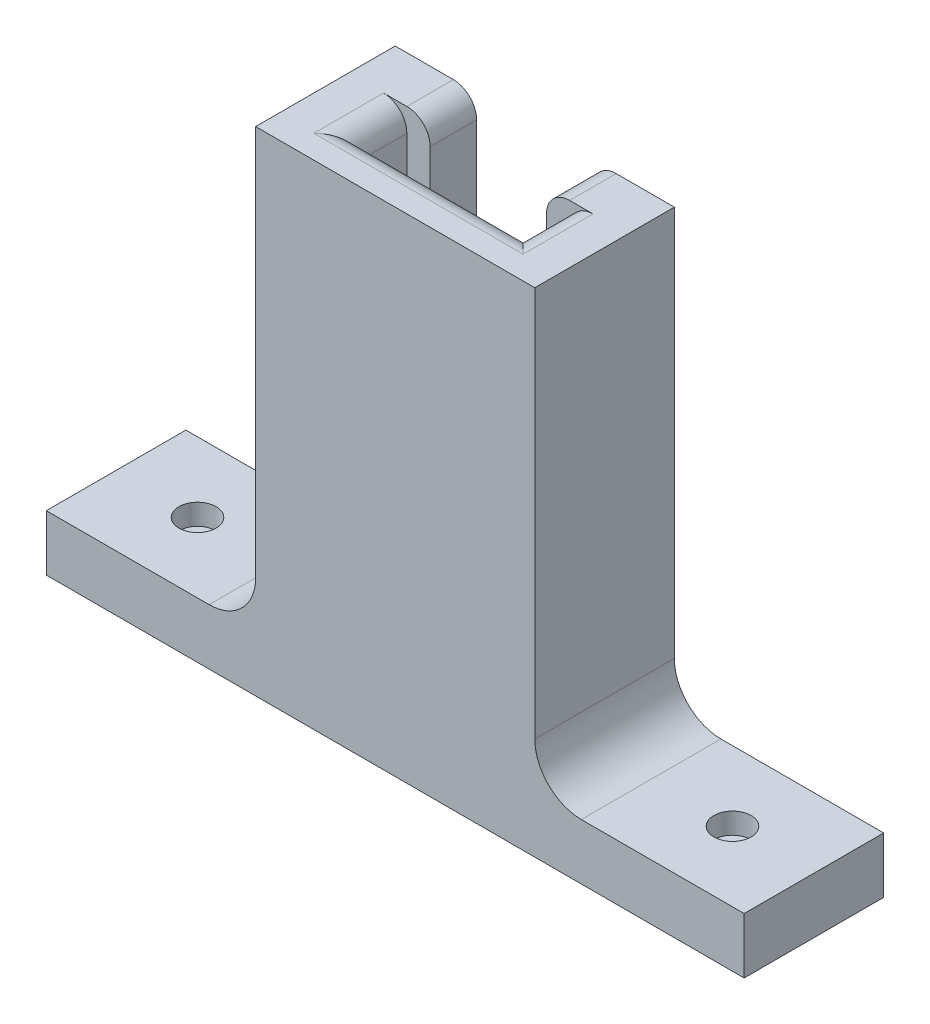
ISO-10303-21;
HEADER;
FILE_DESCRIPTION(('STEP AP214'),'2;1');
FILE_NAME('part.step','',(''),(''),'','','');
FILE_SCHEMA(('AUTOMOTIVE_DESIGN { 1 0 10303 214 1 1 1 1 }'));
ENDSEC;
DATA;
#1=APPLICATION_CONTEXT('core data for automotive mechanical design processes');
#2=APPLICATION_PROTOCOL_DEFINITION('international standard','automotive_design',2000,#1);
#3=PRODUCT_CONTEXT('',#1,'mechanical');
#4=PRODUCT('Part','Part','',(#3));
#5=PRODUCT_RELATED_PRODUCT_CATEGORY('part','',(#4));
#6=PRODUCT_DEFINITION_FORMATION('','',#4);
#7=PRODUCT_DEFINITION_CONTEXT('part definition',#1,'design');
#8=PRODUCT_DEFINITION('design','',#6,#7);
#9=PRODUCT_DEFINITION_SHAPE('','',#8);
#10=(LENGTH_UNIT() NAMED_UNIT(*) SI_UNIT(.MILLI.,.METRE.));
#11=(NAMED_UNIT(*) PLANE_ANGLE_UNIT() SI_UNIT($,.RADIAN.));
#12=(NAMED_UNIT(*) SI_UNIT($,.STERADIAN.) SOLID_ANGLE_UNIT());
#13=UNCERTAINTY_MEASURE_WITH_UNIT(LENGTH_MEASURE(1.E-05),#10,'distance_accuracy_value','');
#14=(GEOMETRIC_REPRESENTATION_CONTEXT(3) GLOBAL_UNCERTAINTY_ASSIGNED_CONTEXT((#13)) GLOBAL_UNIT_ASSIGNED_CONTEXT((#10,
#11,#12)) REPRESENTATION_CONTEXT('',''));
#15=CARTESIAN_POINT('',(0.,0.,0.));
#16=DIRECTION('',(0.,0.,1.));
#17=DIRECTION('',(1.,0.,0.));
#18=AXIS2_PLACEMENT_3D('',#15,#16,#17);
#19=CARTESIAN_POINT('',(57.5,-95.,15.));
#20=DIRECTION('',(0.,1.,0.));
#21=DIRECTION('',(0.,0.,1.));
#22=AXIS2_PLACEMENT_3D('',#19,#20,#21);
#23=CYLINDRICAL_SURFACE('',#22,2.);
#24=CARTESIAN_POINT('',(57.5,-56.,15.));
#25=DIRECTION('',(0.,-1.,0.));
#26=DIRECTION('',(0.,0.,-1.));
#27=AXIS2_PLACEMENT_3D('',#24,#25,#26);
#28=CIRCLE('',#27,2.);
#29=CARTESIAN_POINT('',(57.5,-56.,13.));
#30=VERTEX_POINT('',#29);
#31=EDGE_CURVE('E286',#30,#30,#28,.F.);
#32=ORIENTED_EDGE('',*,*,#31,.F.);
#33=EDGE_LOOP('',(#32));
#34=FACE_BOUND('',#33,.T.);
#35=CARTESIAN_POINT('',(57.5,-48.5,15.));
#36=DIRECTION('',(0.,1.,0.));
#37=DIRECTION('',(0.,0.,1.));
#38=AXIS2_PLACEMENT_3D('',#35,#36,#37);
#39=CIRCLE('',#38,2.);
#40=CARTESIAN_POINT('',(57.5,-48.5,17.));
#41=VERTEX_POINT('',#40);
#42=EDGE_CURVE('E79',#41,#41,#39,.T.);
#43=ORIENTED_EDGE('',*,*,#42,.T.);
#44=EDGE_LOOP('',(#43));
#45=FACE_BOUND('',#44,.T.);
#46=ADVANCED_FACE('F75',(#34,#45),#23,.F.);
#47=CARTESIAN_POINT('',(-57.5,-95.,15.));
#48=DIRECTION('',(0.,1.,0.));
#49=DIRECTION('',(0.,0.,1.));
#50=AXIS2_PLACEMENT_3D('',#47,#48,#49);
#51=CYLINDRICAL_SURFACE('',#50,2.);
#52=CARTESIAN_POINT('',(-57.5,-56.,15.));
#53=DIRECTION('',(0.,-1.,0.));
#54=DIRECTION('',(0.,0.,-1.));
#55=AXIS2_PLACEMENT_3D('',#52,#53,#54);
#56=CIRCLE('',#55,2.);
#57=CARTESIAN_POINT('',(-57.5,-56.,13.));
#58=VERTEX_POINT('',#57);
#59=EDGE_CURVE('E271',#58,#58,#56,.T.);
#60=ORIENTED_EDGE('',*,*,#59,.T.);
#61=EDGE_LOOP('',(#60));
#62=FACE_BOUND('',#61,.T.);
#63=CARTESIAN_POINT('',(-57.5,-48.5,15.));
#64=DIRECTION('',(0.,1.,0.));
#65=DIRECTION('',(0.,0.,1.));
#66=AXIS2_PLACEMENT_3D('',#63,#64,#65);
#67=CIRCLE('',#66,2.);
#68=CARTESIAN_POINT('',(-57.5,-48.5,17.));
#69=VERTEX_POINT('',#68);
#70=EDGE_CURVE('E273',#69,#69,#67,.F.);
#71=ORIENTED_EDGE('',*,*,#70,.F.);
#72=EDGE_LOOP('',(#71));
#73=FACE_BOUND('',#72,.T.);
#74=ADVANCED_FACE('F508',(#62,#73),#51,.F.);
#75=CARTESIAN_POINT('',(0.,0.,0.));
#76=DIRECTION('',(0.,0.,1.));
#77=DIRECTION('',(1.,0.,0.));
#78=AXIS2_PLACEMENT_3D('',#75,#76,#77);
#79=PLANE('',#78);
#80=DIRECTION('',(0.,1.,0.));
#81=VECTOR('',#80,1.);
#82=CARTESIAN_POINT('',(12.5,-172.,0.));
#83=LINE('',#82,#81);
#84=CARTESIAN_POINT('',(12.5,-56.,0.));
#85=VERTEX_POINT('',#84);
#86=CARTESIAN_POINT('',(12.5,45.,0.));
#87=VERTEX_POINT('',#86);
#88=EDGE_CURVE('E295',#85,#87,#83,.T.);
#89=ORIENTED_EDGE('',*,*,#88,.T.);
#90=CARTESIAN_POINT('',(17.5,45.,0.));
#91=DIRECTION('',(0.,0.,1.));
#92=DIRECTION('',(1.,0.,0.));
#93=AXIS2_PLACEMENT_3D('',#90,#91,#92);
#94=CIRCLE('',#93,5.);
#95=CARTESIAN_POINT('',(17.5,50.,0.));
#96=VERTEX_POINT('',#95);
#97=EDGE_CURVE('E258',#87,#96,#94,.F.);
#98=ORIENTED_EDGE('',*,*,#97,.T.);
#99=DIRECTION('',(-1.,0.,0.));
#100=VECTOR('',#99,1.);
#101=CARTESIAN_POINT('',(30.,50.,0.));
#102=LINE('',#101,#100);
#103=CARTESIAN_POINT('',(30.,50.,0.));
#104=VERTEX_POINT('',#103);
#105=EDGE_CURVE('E378',#104,#96,#102,.T.);
#106=ORIENTED_EDGE('',*,*,#105,.F.);
#107=DIRECTION('',(0.,-1.,0.));
#108=VECTOR('',#107,1.);
#109=CARTESIAN_POINT('',(30.,50.,0.));
#110=LINE('',#109,#108);
#111=CARTESIAN_POINT('',(30.,-34.,0.));
#112=VERTEX_POINT('',#111);
#113=EDGE_CURVE('E369',#104,#112,#110,.T.);
#114=ORIENTED_EDGE('',*,*,#113,.T.);
#115=CARTESIAN_POINT('',(40.,-34.,0.));
#116=DIRECTION('',(0.,0.,1.));
#117=DIRECTION('',(1.,0.,0.));
#118=AXIS2_PLACEMENT_3D('',#115,#116,#117);
#119=CIRCLE('',#118,10.);
#120=CARTESIAN_POINT('',(40.,-44.,0.));
#121=VERTEX_POINT('',#120);
#122=EDGE_CURVE('E395',#112,#121,#119,.T.);
#123=ORIENTED_EDGE('',*,*,#122,.T.);
#124=DIRECTION('',(-1.,0.,0.));
#125=VECTOR('',#124,1.);
#126=CARTESIAN_POINT('',(0.,-44.,0.));
#127=LINE('',#126,#125);
#128=CARTESIAN_POINT('',(75.,-44.,0.));
#129=VERTEX_POINT('',#128);
#130=EDGE_CURVE('E332',#129,#121,#127,.T.);
#131=ORIENTED_EDGE('',*,*,#130,.F.);
#132=DIRECTION('',(0.,-1.,0.));
#133=VECTOR('',#132,1.);
#134=CARTESIAN_POINT('',(75.,0.,0.));
#135=LINE('',#134,#133);
#136=CARTESIAN_POINT('',(75.,-56.,0.));
#137=VERTEX_POINT('',#136);
#138=EDGE_CURVE('E351',#129,#137,#135,.T.);
#139=ORIENTED_EDGE('',*,*,#138,.T.);
#140=DIRECTION('',(-1.,0.,0.));
#141=VECTOR('',#140,1.);
#142=CARTESIAN_POINT('',(0.,-56.,0.));
#143=LINE('',#142,#141);
#144=EDGE_CURVE('E348',#137,#85,#143,.T.);
#145=ORIENTED_EDGE('',*,*,#144,.T.);
#146=EDGE_LOOP('',(#89,#98,#106,#114,#123,#131,#139,#145));
#147=FACE_BOUND('',#146,.T.);
#148=ADVANCED_FACE('F417',(#147),#79,.F.);
#149=CARTESIAN_POINT('',(-75.,0.,30.));
#150=DIRECTION('',(1.,0.,0.));
#151=DIRECTION('',(0.,0.,-1.));
#152=AXIS2_PLACEMENT_3D('',#149,#150,#151);
#153=PLANE('',#152);
#154=DIRECTION('',(0.,-1.,0.));
#155=VECTOR('',#154,1.);
#156=CARTESIAN_POINT('',(-75.,0.,0.));
#157=LINE('',#156,#155);
#158=CARTESIAN_POINT('',(-75.,-44.,0.));
#159=VERTEX_POINT('',#158);
#160=CARTESIAN_POINT('',(-75.,-56.,0.));
#161=VERTEX_POINT('',#160);
#162=EDGE_CURVE('E343',#159,#161,#157,.T.);
#163=ORIENTED_EDGE('',*,*,#162,.T.);
#164=DIRECTION('',(0.,0.,-1.));
#165=VECTOR('',#164,1.);
#166=CARTESIAN_POINT('',(-75.,-56.,30.));
#167=LINE('',#166,#165);
#168=CARTESIAN_POINT('',(-75.,-56.,30.));
#169=VERTEX_POINT('',#168);
#170=EDGE_CURVE('E358',#169,#161,#167,.T.);
#171=ORIENTED_EDGE('',*,*,#170,.F.);
#172=DIRECTION('',(0.,-1.,0.));
#173=VECTOR('',#172,1.);
#174=CARTESIAN_POINT('',(-75.,0.,30.));
#175=LINE('',#174,#173);
#176=CARTESIAN_POINT('',(-75.,-44.,30.));
#177=VERTEX_POINT('',#176);
#178=EDGE_CURVE('E331',#177,#169,#175,.T.);
#179=ORIENTED_EDGE('',*,*,#178,.F.);
#180=DIRECTION('',(0.,0.,-1.));
#181=VECTOR('',#180,1.);
#182=CARTESIAN_POINT('',(-75.,-44.,30.));
#183=LINE('',#182,#181);
#184=EDGE_CURVE('E361',#177,#159,#183,.T.);
#185=ORIENTED_EDGE('',*,*,#184,.T.);
#186=EDGE_LOOP('',(#163,#171,#179,#185));
#187=FACE_BOUND('',#186,.T.);
#188=ADVANCED_FACE('F460',(#187),#153,.F.);
#189=CARTESIAN_POINT('',(0.,-56.,30.));
#190=DIRECTION('',(0.,-1.,0.));
#191=DIRECTION('',(0.,0.,-1.));
#192=AXIS2_PLACEMENT_3D('',#189,#190,#191);
#193=PLANE('',#192);
#194=ORIENTED_EDGE('',*,*,#31,.T.);
#195=EDGE_LOOP('',(#194));
#196=FACE_BOUND('',#195,.T.);
#197=ORIENTED_EDGE('',*,*,#59,.F.);
#198=EDGE_LOOP('',(#197));
#199=FACE_BOUND('',#198,.T.);
#200=DIRECTION('',(0.,0.,-1.));
#201=VECTOR('',#200,1.);
#202=CARTESIAN_POINT('',(-12.5,-56.,30.));
#203=LINE('',#202,#201);
#204=CARTESIAN_POINT('',(-12.5,-56.,10.));
#205=VERTEX_POINT('',#204);
#206=CARTESIAN_POINT('',(-12.5,-56.,0.));
#207=VERTEX_POINT('',#206);
#208=EDGE_CURVE('E326',#205,#207,#203,.T.);
#209=ORIENTED_EDGE('',*,*,#208,.F.);
#210=DIRECTION('',(1.,0.,0.));
#211=VECTOR('',#210,1.);
#212=CARTESIAN_POINT('',(0.,-56.,10.));
#213=LINE('',#212,#211);
#214=CARTESIAN_POINT('',(-17.5,-56.,10.));
#215=VERTEX_POINT('',#214);
#216=EDGE_CURVE('E294',#215,#205,#213,.T.);
#217=ORIENTED_EDGE('',*,*,#216,.F.);
#218=DIRECTION('',(0.,0.,-1.));
#219=VECTOR('',#218,1.);
#220=CARTESIAN_POINT('',(-17.5,-56.,30.));
#221=LINE('',#220,#219);
#222=CARTESIAN_POINT('',(-17.5,-56.,20.));
#223=VERTEX_POINT('',#222);
#224=EDGE_CURVE('E313',#223,#215,#221,.T.);
#225=ORIENTED_EDGE('',*,*,#224,.F.);
#226=DIRECTION('',(1.,0.,0.));
#227=VECTOR('',#226,1.);
#228=CARTESIAN_POINT('',(0.,-56.,20.));
#229=LINE('',#228,#227);
#230=CARTESIAN_POINT('',(17.5,-56.,20.));
#231=VERTEX_POINT('',#230);
#232=EDGE_CURVE('E315',#223,#231,#229,.T.);
#233=ORIENTED_EDGE('',*,*,#232,.T.);
#234=DIRECTION('',(0.,0.,-1.));
#235=VECTOR('',#234,1.);
#236=CARTESIAN_POINT('',(17.5,-56.,30.));
#237=LINE('',#236,#235);
#238=CARTESIAN_POINT('',(17.5,-56.,10.));
#239=VERTEX_POINT('',#238);
#240=EDGE_CURVE('E318',#231,#239,#237,.T.);
#241=ORIENTED_EDGE('',*,*,#240,.T.);
#242=DIRECTION('',(1.,0.,0.));
#243=VECTOR('',#242,1.);
#244=CARTESIAN_POINT('',(0.,-56.,10.));
#245=LINE('',#244,#243);
#246=CARTESIAN_POINT('',(12.5,-56.,10.));
#247=VERTEX_POINT('',#246);
#248=EDGE_CURVE('E321',#247,#239,#245,.T.);
#249=ORIENTED_EDGE('',*,*,#248,.F.);
#250=DIRECTION('',(0.,0.,-1.));
#251=VECTOR('',#250,1.);
#252=CARTESIAN_POINT('',(12.5,-56.,30.));
#253=LINE('',#252,#251);
#254=EDGE_CURVE('E323',#247,#85,#253,.T.);
#255=ORIENTED_EDGE('',*,*,#254,.T.);
#256=ORIENTED_EDGE('',*,*,#144,.F.);
#257=DIRECTION('',(0.,0.,-1.));
#258=VECTOR('',#257,1.);
#259=CARTESIAN_POINT('',(75.,-56.,30.));
#260=LINE('',#259,#258);
#261=CARTESIAN_POINT('',(75.,-56.,30.));
#262=VERTEX_POINT('',#261);
#263=EDGE_CURVE('E356',#262,#137,#260,.T.);
#264=ORIENTED_EDGE('',*,*,#263,.F.);
#265=DIRECTION('',(-1.,0.,0.));
#266=VECTOR('',#265,1.);
#267=CARTESIAN_POINT('',(0.,-56.,30.));
#268=LINE('',#267,#266);
#269=EDGE_CURVE('E335',#262,#169,#268,.T.);
#270=ORIENTED_EDGE('',*,*,#269,.T.);
#271=ORIENTED_EDGE('',*,*,#170,.T.);
#272=EDGE_CURVE('E347',#207,#161,#143,.T.);
#273=ORIENTED_EDGE('',*,*,#272,.F.);
#274=EDGE_LOOP('',(#209,#217,#225,#233,#241,#249,#255,#256,#264,#270,#271,#273));
#275=FACE_BOUND('',#274,.T.);
#276=ADVANCED_FACE('F426',(#196,#199,#275),#193,.T.);
#277=CARTESIAN_POINT('',(75.,0.,30.));
#278=DIRECTION('',(1.,0.,0.));
#279=DIRECTION('',(0.,0.,-1.));
#280=AXIS2_PLACEMENT_3D('',#277,#278,#279);
#281=PLANE('',#280);
#282=ORIENTED_EDGE('',*,*,#138,.F.);
#283=DIRECTION('',(0.,0.,-1.));
#284=VECTOR('',#283,1.);
#285=CARTESIAN_POINT('',(75.,-44.,30.));
#286=LINE('',#285,#284);
#287=CARTESIAN_POINT('',(75.,-44.,30.));
#288=VERTEX_POINT('',#287);
#289=EDGE_CURVE('E354',#288,#129,#286,.T.);
#290=ORIENTED_EDGE('',*,*,#289,.F.);
#291=DIRECTION('',(0.,-1.,0.));
#292=VECTOR('',#291,1.);
#293=CARTESIAN_POINT('',(75.,0.,30.));
#294=LINE('',#293,#292);
#295=EDGE_CURVE('E338',#288,#262,#294,.T.);
#296=ORIENTED_EDGE('',*,*,#295,.T.);
#297=ORIENTED_EDGE('',*,*,#263,.T.);
#298=EDGE_LOOP('',(#282,#290,#296,#297));
#299=FACE_BOUND('',#298,.T.);
#300=ADVANCED_FACE('F496',(#299),#281,.T.);
#301=CARTESIAN_POINT('',(0.,-44.,30.));
#302=DIRECTION('',(0.,-1.,0.));
#303=DIRECTION('',(0.,0.,-1.));
#304=AXIS2_PLACEMENT_3D('',#301,#302,#303);
#305=PLANE('',#304);
#306=CARTESIAN_POINT('',(57.5,-44.,15.));
#307=DIRECTION('',(0.,-1.,0.));
#308=DIRECTION('',(0.,0.,1.));
#309=AXIS2_PLACEMENT_3D('',#306,#307,#308);
#310=CIRCLE('',#309,4.00000000000001);
#311=CARTESIAN_POINT('',(57.5,-44.,19.));
#312=VERTEX_POINT('',#311);
#313=EDGE_CURVE('E824',#312,#312,#310,.T.);
#314=ORIENTED_EDGE('',*,*,#313,.T.);
#315=EDGE_LOOP('',(#314));
#316=FACE_BOUND('',#315,.T.);
#317=ORIENTED_EDGE('',*,*,#130,.T.);
#318=DIRECTION('',(0.,0.,-1.));
#319=VECTOR('',#318,1.);
#320=CARTESIAN_POINT('',(40.,-44.,30.));
#321=LINE('',#320,#319);
#322=CARTESIAN_POINT('',(40.,-44.,30.));
#323=VERTEX_POINT('',#322);
#324=EDGE_CURVE('E388',#121,#323,#321,.F.);
#325=ORIENTED_EDGE('',*,*,#324,.T.);
#326=DIRECTION('',(-1.,0.,0.));
#327=VECTOR('',#326,1.);
#328=CARTESIAN_POINT('',(0.,-44.,30.));
#329=LINE('',#328,#327);
#330=EDGE_CURVE('E333',#288,#323,#329,.T.);
#331=ORIENTED_EDGE('',*,*,#330,.F.);
#332=ORIENTED_EDGE('',*,*,#289,.T.);
#333=EDGE_LOOP('',(#317,#325,#331,#332));
#334=FACE_BOUND('',#333,.T.);
#335=ADVANCED_FACE('F489',(#316,#334),#305,.F.);
#336=CARTESIAN_POINT('',(-57.5,-44.,15.));
#337=DIRECTION('',(0.,1.,0.));
#338=DIRECTION('',(0.,0.,1.));
#339=AXIS2_PLACEMENT_3D('',#336,#337,#338);
#340=CIRCLE('',#339,4.00000000000001);
#341=CARTESIAN_POINT('',(-57.5,-44.,19.));
#342=VERTEX_POINT('',#341);
#343=EDGE_CURVE('E281',#342,#342,#340,.T.);
#344=ORIENTED_EDGE('',*,*,#343,.F.);
#345=EDGE_LOOP('',(#344));
#346=FACE_BOUND('',#345,.T.);
#347=CARTESIAN_POINT('',(-40.,-44.,30.));
#348=VERTEX_POINT('',#347);
#349=EDGE_CURVE('E329',#348,#177,#329,.T.);
#350=ORIENTED_EDGE('',*,*,#349,.F.);
#351=DIRECTION('',(0.,0.,-1.));
#352=VECTOR('',#351,1.);
#353=CARTESIAN_POINT('',(-40.,-44.,0.));
#354=LINE('',#353,#352);
#355=CARTESIAN_POINT('',(-40.,-44.,0.));
#356=VERTEX_POINT('',#355);
#357=EDGE_CURVE('E390',#348,#356,#354,.T.);
#358=ORIENTED_EDGE('',*,*,#357,.T.);
#359=EDGE_CURVE('E341',#356,#159,#127,.T.);
#360=ORIENTED_EDGE('',*,*,#359,.T.);
#361=ORIENTED_EDGE('',*,*,#184,.F.);
#362=EDGE_LOOP('',(#350,#358,#360,#361));
#363=FACE_BOUND('',#362,.T.);
#364=ADVANCED_FACE('F466',(#346,#363),#305,.F.);
#365=CARTESIAN_POINT('',(-17.5,50.,0.));
#366=VERTEX_POINT('',#365);
#367=CARTESIAN_POINT('',(-30.,50.,0.));
#368=VERTEX_POINT('',#367);
#369=EDGE_CURVE('E377',#366,#368,#102,.T.);
#370=ORIENTED_EDGE('',*,*,#369,.F.);
#371=CARTESIAN_POINT('',(-17.5,45.,0.));
#372=DIRECTION('',(0.,0.,1.));
#373=DIRECTION('',(1.,0.,0.));
#374=AXIS2_PLACEMENT_3D('',#371,#372,#373);
#375=CIRCLE('',#374,5.);
#376=CARTESIAN_POINT('',(-12.5,45.,0.));
#377=VERTEX_POINT('',#376);
#378=EDGE_CURVE('E238',#366,#377,#375,.F.);
#379=ORIENTED_EDGE('',*,*,#378,.T.);
#380=DIRECTION('',(0.,1.,0.));
#381=VECTOR('',#380,1.);
#382=CARTESIAN_POINT('',(-12.5,-172.,0.));
#383=LINE('',#382,#381);
#384=EDGE_CURVE('E291',#207,#377,#383,.T.);
#385=ORIENTED_EDGE('',*,*,#384,.F.);
#386=ORIENTED_EDGE('',*,*,#272,.T.);
#387=ORIENTED_EDGE('',*,*,#162,.F.);
#388=ORIENTED_EDGE('',*,*,#359,.F.);
#389=CARTESIAN_POINT('',(-40.,-34.,0.));
#390=DIRECTION('',(0.,0.,1.));
#391=DIRECTION('',(1.,0.,0.));
#392=AXIS2_PLACEMENT_3D('',#389,#390,#391);
#393=CIRCLE('',#392,10.);
#394=CARTESIAN_POINT('',(-30.,-34.,0.));
#395=VERTEX_POINT('',#394);
#396=EDGE_CURVE('E399',#356,#395,#393,.T.);
#397=ORIENTED_EDGE('',*,*,#396,.T.);
#398=DIRECTION('',(0.,-1.,0.));
#399=VECTOR('',#398,1.);
#400=CARTESIAN_POINT('',(-30.,50.,0.));
#401=LINE('',#400,#399);
#402=EDGE_CURVE('E328',#368,#395,#401,.T.);
#403=ORIENTED_EDGE('',*,*,#402,.F.);
#404=EDGE_LOOP('',(#370,#379,#385,#386,#387,#388,#397,#403));
#405=FACE_BOUND('',#404,.T.);
#406=ADVANCED_FACE('F454',(#405),#79,.F.);
#407=CARTESIAN_POINT('',(0.,0.,30.));
#408=DIRECTION('',(0.,0.,1.));
#409=DIRECTION('',(1.,0.,0.));
#410=AXIS2_PLACEMENT_3D('',#407,#408,#409);
#411=PLANE('',#410);
#412=DIRECTION('',(0.,-1.,0.));
#413=VECTOR('',#412,1.);
#414=CARTESIAN_POINT('',(-30.,50.,30.));
#415=LINE('',#414,#413);
#416=CARTESIAN_POINT('',(-30.,50.,30.));
#417=VERTEX_POINT('',#416);
#418=CARTESIAN_POINT('',(-30.,-34.,30.));
#419=VERTEX_POINT('',#418);
#420=EDGE_CURVE('E365',#417,#419,#415,.T.);
#421=ORIENTED_EDGE('',*,*,#420,.T.);
#422=CARTESIAN_POINT('',(-40.,-34.,30.));
#423=DIRECTION('',(0.,0.,1.));
#424=DIRECTION('',(1.,0.,0.));
#425=AXIS2_PLACEMENT_3D('',#422,#423,#424);
#426=CIRCLE('',#425,10.);
#427=EDGE_CURVE('E401',#419,#348,#426,.F.);
#428=ORIENTED_EDGE('',*,*,#427,.T.);
#429=ORIENTED_EDGE('',*,*,#349,.T.);
#430=ORIENTED_EDGE('',*,*,#178,.T.);
#431=ORIENTED_EDGE('',*,*,#269,.F.);
#432=ORIENTED_EDGE('',*,*,#295,.F.);
#433=ORIENTED_EDGE('',*,*,#330,.T.);
#434=CARTESIAN_POINT('',(40.,-34.,30.));
#435=DIRECTION('',(0.,0.,1.));
#436=DIRECTION('',(1.,0.,0.));
#437=AXIS2_PLACEMENT_3D('',#434,#435,#436);
#438=CIRCLE('',#437,10.);
#439=CARTESIAN_POINT('',(30.,-34.,30.));
#440=VERTEX_POINT('',#439);
#441=EDGE_CURVE('E397',#323,#440,#438,.F.);
#442=ORIENTED_EDGE('',*,*,#441,.T.);
#443=DIRECTION('',(0.,-1.,0.));
#444=VECTOR('',#443,1.);
#445=CARTESIAN_POINT('',(30.,50.,30.));
#446=LINE('',#445,#444);
#447=CARTESIAN_POINT('',(30.,50.,30.));
#448=VERTEX_POINT('',#447);
#449=EDGE_CURVE('E371',#448,#440,#446,.T.);
#450=ORIENTED_EDGE('',*,*,#449,.F.);
#451=DIRECTION('',(-1.,0.,0.));
#452=VECTOR('',#451,1.);
#453=CARTESIAN_POINT('',(30.,50.,30.));
#454=LINE('',#453,#452);
#455=EDGE_CURVE('E368',#448,#417,#454,.T.);
#456=ORIENTED_EDGE('',*,*,#455,.T.);
#457=EDGE_LOOP('',(#421,#428,#429,#430,#431,#432,#433,#442,#450,#456));
#458=FACE_BOUND('',#457,.T.);
#459=ADVANCED_FACE('F476',(#458),#411,.T.);
#460=CARTESIAN_POINT('',(30.,50.,30.));
#461=DIRECTION('',(1.,0.,0.));
#462=DIRECTION('',(0.,0.,-1.));
#463=AXIS2_PLACEMENT_3D('',#460,#461,#462);
#464=PLANE('',#463);
#465=ORIENTED_EDGE('',*,*,#449,.T.);
#466=DIRECTION('',(0.,0.,-1.));
#467=VECTOR('',#466,1.);
#468=CARTESIAN_POINT('',(30.,-34.,30.));
#469=LINE('',#468,#467);
#470=EDGE_CURVE('E364',#440,#112,#469,.T.);
#471=ORIENTED_EDGE('',*,*,#470,.T.);
#472=ORIENTED_EDGE('',*,*,#113,.F.);
#473=DIRECTION('',(0.,0.,-1.));
#474=VECTOR('',#473,1.);
#475=CARTESIAN_POINT('',(30.,50.,30.));
#476=LINE('',#475,#474);
#477=EDGE_CURVE('E344',#448,#104,#476,.T.);
#478=ORIENTED_EDGE('',*,*,#477,.F.);
#479=EDGE_LOOP('',(#465,#471,#472,#478));
#480=FACE_BOUND('',#479,.T.);
#481=ADVANCED_FACE('F481',(#480),#464,.T.);
#482=CARTESIAN_POINT('',(30.,50.,30.));
#483=DIRECTION('',(0.,-1.,0.));
#484=DIRECTION('',(1.,0.,0.));
#485=AXIS2_PLACEMENT_3D('',#482,#483,#484);
#486=PLANE('',#485);
#487=DIRECTION('',(-1.,0.,0.));
#488=VECTOR('',#487,1.);
#489=CARTESIAN_POINT('',(0.,50.,10.));
#490=LINE('',#489,#488);
#491=CARTESIAN_POINT('',(-22.5,50.,10.));
#492=VERTEX_POINT('',#491);
#493=CARTESIAN_POINT('',(-17.5,50.,10.));
#494=VERTEX_POINT('',#493);
#495=EDGE_CURVE('E230',#492,#494,#490,.F.);
#496=ORIENTED_EDGE('',*,*,#495,.T.);
#497=DIRECTION('',(0.,0.,1.));
#498=VECTOR('',#497,1.);
#499=CARTESIAN_POINT('',(-17.5,50.,30.));
#500=LINE('',#499,#498);
#501=EDGE_CURVE('E243',#494,#366,#500,.F.);
#502=ORIENTED_EDGE('',*,*,#501,.T.);
#503=ORIENTED_EDGE('',*,*,#369,.T.);
#504=DIRECTION('',(0.,0.,-1.));
#505=VECTOR('',#504,1.);
#506=CARTESIAN_POINT('',(-30.,50.,30.));
#507=LINE('',#506,#505);
#508=EDGE_CURVE('E374',#417,#368,#507,.T.);
#509=ORIENTED_EDGE('',*,*,#508,.F.);
#510=ORIENTED_EDGE('',*,*,#455,.F.);
#511=ORIENTED_EDGE('',*,*,#477,.T.);
#512=ORIENTED_EDGE('',*,*,#105,.T.);
#513=DIRECTION('',(0.,0.,1.));
#514=VECTOR('',#513,1.);
#515=CARTESIAN_POINT('',(17.5,50.,10.));
#516=LINE('',#515,#514);
#517=CARTESIAN_POINT('',(17.5,50.,10.));
#518=VERTEX_POINT('',#517);
#519=EDGE_CURVE('E410',#96,#518,#516,.T.);
#520=ORIENTED_EDGE('',*,*,#519,.T.);
#521=DIRECTION('',(-1.,0.,0.));
#522=VECTOR('',#521,1.);
#523=CARTESIAN_POINT('',(0.,50.,10.));
#524=LINE('',#523,#522);
#525=CARTESIAN_POINT('',(22.5,50.,10.));
#526=VERTEX_POINT('',#525);
#527=EDGE_CURVE('E403',#518,#526,#524,.F.);
#528=ORIENTED_EDGE('',*,*,#527,.T.);
#529=DIRECTION('',(0.,0.,1.));
#530=VECTOR('',#529,1.);
#531=CARTESIAN_POINT('',(22.5,50.,20.));
#532=LINE('',#531,#530);
#533=CARTESIAN_POINT('',(22.5,50.,25.));
#534=VERTEX_POINT('',#533);
#535=EDGE_CURVE('E406',#526,#534,#532,.T.);
#536=ORIENTED_EDGE('',*,*,#535,.T.);
#537=DIRECTION('',(-1.,0.,0.));
#538=VECTOR('',#537,1.);
#539=CARTESIAN_POINT('',(-17.5,50.,25.));
#540=LINE('',#539,#538);
#541=CARTESIAN_POINT('',(-22.5,50.,25.));
#542=VERTEX_POINT('',#541);
#543=EDGE_CURVE('E408',#534,#542,#540,.T.);
#544=ORIENTED_EDGE('',*,*,#543,.T.);
#545=DIRECTION('',(0.,0.,1.));
#546=VECTOR('',#545,1.);
#547=CARTESIAN_POINT('',(-22.5,50.,30.));
#548=LINE('',#547,#546);
#549=EDGE_CURVE('E247',#542,#492,#548,.F.);
#550=ORIENTED_EDGE('',*,*,#549,.T.);
#551=EDGE_LOOP('',(#496,#502,#503,#509,#510,#511,#512,#520,#528,#536,#544,#550));
#552=FACE_BOUND('',#551,.T.);
#553=ADVANCED_FACE('F242',(#552),#486,.F.);
#554=CARTESIAN_POINT('',(-30.,50.,30.));
#555=DIRECTION('',(1.,0.,0.));
#556=DIRECTION('',(0.,1.,0.));
#557=AXIS2_PLACEMENT_3D('',#554,#555,#556);
#558=PLANE('',#557);
#559=ORIENTED_EDGE('',*,*,#402,.T.);
#560=DIRECTION('',(0.,0.,-1.));
#561=VECTOR('',#560,1.);
#562=CARTESIAN_POINT('',(-30.,-34.,30.));
#563=LINE('',#562,#561);
#564=EDGE_CURVE('E393',#395,#419,#563,.F.);
#565=ORIENTED_EDGE('',*,*,#564,.T.);
#566=ORIENTED_EDGE('',*,*,#420,.F.);
#567=ORIENTED_EDGE('',*,*,#508,.T.);
#568=EDGE_LOOP('',(#559,#565,#566,#567));
#569=FACE_BOUND('',#568,.T.);
#570=ADVANCED_FACE('F474',(#569),#558,.F.);
#571=CARTESIAN_POINT('',(40.,-34.,30.));
#572=DIRECTION('',(0.,0.,-1.));
#573=DIRECTION('',(-1.,0.,0.));
#574=AXIS2_PLACEMENT_3D('',#571,#572,#573);
#575=CYLINDRICAL_SURFACE('',#574,10.);
#576=ORIENTED_EDGE('',*,*,#441,.F.);
#577=ORIENTED_EDGE('',*,*,#324,.F.);
#578=ORIENTED_EDGE('',*,*,#122,.F.);
#579=ORIENTED_EDGE('',*,*,#470,.F.);
#580=EDGE_LOOP('',(#576,#577,#578,#579));
#581=FACE_BOUND('',#580,.T.);
#582=ADVANCED_FACE('F493',(#581),#575,.F.);
#583=CARTESIAN_POINT('',(-40.,-34.,30.));
#584=DIRECTION('',(0.,0.,1.));
#585=DIRECTION('',(1.,0.,0.));
#586=AXIS2_PLACEMENT_3D('',#583,#584,#585);
#587=CYLINDRICAL_SURFACE('',#586,10.);
#588=ORIENTED_EDGE('',*,*,#427,.F.);
#589=ORIENTED_EDGE('',*,*,#564,.F.);
#590=ORIENTED_EDGE('',*,*,#396,.F.);
#591=ORIENTED_EDGE('',*,*,#357,.F.);
#592=EDGE_LOOP('',(#588,#589,#590,#591));
#593=FACE_BOUND('',#592,.T.);
#594=ADVANCED_FACE('F470',(#593),#587,.F.);
#595=CARTESIAN_POINT('',(-12.5,-172.,0.));
#596=DIRECTION('',(-1.,0.,0.));
#597=DIRECTION('',(0.,0.,1.));
#598=AXIS2_PLACEMENT_3D('',#595,#596,#597);
#599=PLANE('',#598);
#600=ORIENTED_EDGE('',*,*,#384,.T.);
#601=DIRECTION('',(0.,0.,1.));
#602=VECTOR('',#601,1.);
#603=CARTESIAN_POINT('',(-12.5,45.,0.));
#604=LINE('',#603,#602);
#605=CARTESIAN_POINT('',(-12.5,45.,10.));
#606=VERTEX_POINT('',#605);
#607=EDGE_CURVE('E239',#377,#606,#604,.T.);
#608=ORIENTED_EDGE('',*,*,#607,.T.);
#609=DIRECTION('',(0.,1.,0.));
#610=VECTOR('',#609,1.);
#611=CARTESIAN_POINT('',(-12.5,-172.,10.));
#612=LINE('',#611,#610);
#613=EDGE_CURVE('E233',#205,#606,#612,.T.);
#614=ORIENTED_EDGE('',*,*,#613,.F.);
#615=ORIENTED_EDGE('',*,*,#208,.T.);
#616=EDGE_LOOP('',(#600,#608,#614,#615));
#617=FACE_BOUND('',#616,.T.);
#618=ADVANCED_FACE('F451',(#617),#599,.F.);
#619=CARTESIAN_POINT('',(12.5,-172.,0.));
#620=DIRECTION('',(-1.,0.,0.));
#621=DIRECTION('',(0.,0.,1.));
#622=AXIS2_PLACEMENT_3D('',#619,#620,#621);
#623=PLANE('',#622);
#624=DIRECTION('',(0.,1.,0.));
#625=VECTOR('',#624,1.);
#626=CARTESIAN_POINT('',(12.5,-172.,10.));
#627=LINE('',#626,#625);
#628=CARTESIAN_POINT('',(12.5,45.,10.));
#629=VERTEX_POINT('',#628);
#630=EDGE_CURVE('E298',#247,#629,#627,.T.);
#631=ORIENTED_EDGE('',*,*,#630,.T.);
#632=DIRECTION('',(0.,0.,1.));
#633=VECTOR('',#632,1.);
#634=CARTESIAN_POINT('',(12.5,45.,0.));
#635=LINE('',#634,#633);
#636=EDGE_CURVE('E253',#629,#87,#635,.F.);
#637=ORIENTED_EDGE('',*,*,#636,.T.);
#638=ORIENTED_EDGE('',*,*,#88,.F.);
#639=ORIENTED_EDGE('',*,*,#254,.F.);
#640=EDGE_LOOP('',(#631,#637,#638,#639));
#641=FACE_BOUND('',#640,.T.);
#642=ADVANCED_FACE('F421',(#641),#623,.T.);
#643=CARTESIAN_POINT('',(0.,-172.,10.));
#644=DIRECTION('',(0.,0.,-1.));
#645=DIRECTION('',(-1.,0.,0.));
#646=AXIS2_PLACEMENT_3D('',#643,#644,#645);
#647=PLANE('',#646);
#648=DIRECTION('',(0.,1.,0.));
#649=VECTOR('',#648,1.);
#650=CARTESIAN_POINT('',(17.5,-172.,10.));
#651=LINE('',#650,#649);
#652=CARTESIAN_POINT('',(17.5,45.,10.));
#653=VERTEX_POINT('',#652);
#654=EDGE_CURVE('E301',#239,#653,#651,.T.);
#655=ORIENTED_EDGE('',*,*,#654,.T.);
#656=CARTESIAN_POINT('',(22.5,45.,9.99999999999999));
#657=DIRECTION('',(0.,0.,-1.));
#658=DIRECTION('',(-1.,0.,0.));
#659=AXIS2_PLACEMENT_3D('',#656,#657,#658);
#660=CIRCLE('',#659,5.);
#661=EDGE_CURVE('E12',#653,#526,#660,.T.);
#662=ORIENTED_EDGE('',*,*,#661,.T.);
#663=ORIENTED_EDGE('',*,*,#527,.F.);
#664=CARTESIAN_POINT('',(17.5,45.,9.99999999999999));
#665=DIRECTION('',(0.,0.,-1.));
#666=DIRECTION('',(-1.,0.,0.));
#667=AXIS2_PLACEMENT_3D('',#664,#665,#666);
#668=CIRCLE('',#667,5.);
#669=EDGE_CURVE('E92',#518,#629,#668,.F.);
#670=ORIENTED_EDGE('',*,*,#669,.T.);
#671=ORIENTED_EDGE('',*,*,#630,.F.);
#672=ORIENTED_EDGE('',*,*,#248,.T.);
#673=EDGE_LOOP('',(#655,#662,#663,#670,#671,#672));
#674=FACE_BOUND('',#673,.T.);
#675=ADVANCED_FACE('F429',(#674),#647,.F.);
#676=CARTESIAN_POINT('',(17.5,-172.,0.));
#677=DIRECTION('',(-1.,0.,0.));
#678=DIRECTION('',(0.,-1.,0.));
#679=AXIS2_PLACEMENT_3D('',#676,#677,#678);
#680=PLANE('',#679);
#681=DIRECTION('',(0.,1.,0.));
#682=VECTOR('',#681,1.);
#683=CARTESIAN_POINT('',(17.5,-172.,20.));
#684=LINE('',#683,#682);
#685=CARTESIAN_POINT('',(17.5,45.,20.));
#686=VERTEX_POINT('',#685);
#687=EDGE_CURVE('E304',#231,#686,#684,.T.);
#688=ORIENTED_EDGE('',*,*,#687,.T.);
#689=DIRECTION('',(0.,0.,1.));
#690=VECTOR('',#689,1.);
#691=CARTESIAN_POINT('',(17.5,45.,9.99999999999999));
#692=LINE('',#691,#690);
#693=EDGE_CURVE('E265',#686,#653,#692,.F.);
#694=ORIENTED_EDGE('',*,*,#693,.T.);
#695=ORIENTED_EDGE('',*,*,#654,.F.);
#696=ORIENTED_EDGE('',*,*,#240,.F.);
#697=EDGE_LOOP('',(#688,#694,#695,#696));
#698=FACE_BOUND('',#697,.T.);
#699=ADVANCED_FACE('F432',(#698),#680,.T.);
#700=CARTESIAN_POINT('',(0.,-172.,20.));
#701=DIRECTION('',(0.,0.,-1.));
#702=DIRECTION('',(-1.,0.,0.));
#703=AXIS2_PLACEMENT_3D('',#700,#701,#702);
#704=PLANE('',#703);
#705=DIRECTION('',(0.,1.,0.));
#706=VECTOR('',#705,1.);
#707=CARTESIAN_POINT('',(-17.5,-172.,20.));
#708=LINE('',#707,#706);
#709=CARTESIAN_POINT('',(-17.5,45.,20.));
#710=VERTEX_POINT('',#709);
#711=EDGE_CURVE('E306',#223,#710,#708,.T.);
#712=ORIENTED_EDGE('',*,*,#711,.T.);
#713=DIRECTION('',(-1.,0.,0.));
#714=VECTOR('',#713,1.);
#715=CARTESIAN_POINT('',(17.5,45.,20.));
#716=LINE('',#715,#714);
#717=EDGE_CURVE('E100',#710,#686,#716,.F.);
#718=ORIENTED_EDGE('',*,*,#717,.T.);
#719=ORIENTED_EDGE('',*,*,#687,.F.);
#720=ORIENTED_EDGE('',*,*,#232,.F.);
#721=EDGE_LOOP('',(#712,#718,#719,#720));
#722=FACE_BOUND('',#721,.T.);
#723=ADVANCED_FACE('F535',(#722),#704,.T.);
#724=CARTESIAN_POINT('',(-17.5,-172.,0.));
#725=DIRECTION('',(-1.,0.,0.));
#726=DIRECTION('',(0.,0.,1.));
#727=AXIS2_PLACEMENT_3D('',#724,#725,#726);
#728=PLANE('',#727);
#729=DIRECTION('',(0.,1.,0.));
#730=VECTOR('',#729,1.);
#731=CARTESIAN_POINT('',(-17.5,-172.,10.));
#732=LINE('',#731,#730);
#733=CARTESIAN_POINT('',(-17.5,45.,10.));
#734=VERTEX_POINT('',#733);
#735=EDGE_CURVE('E308',#215,#734,#732,.T.);
#736=ORIENTED_EDGE('',*,*,#735,.T.);
#737=DIRECTION('',(0.,0.,1.));
#738=VECTOR('',#737,1.);
#739=CARTESIAN_POINT('',(-17.5,45.,0.));
#740=LINE('',#739,#738);
#741=EDGE_CURVE('E263',#734,#710,#740,.T.);
#742=ORIENTED_EDGE('',*,*,#741,.T.);
#743=ORIENTED_EDGE('',*,*,#711,.F.);
#744=ORIENTED_EDGE('',*,*,#224,.T.);
#745=EDGE_LOOP('',(#736,#742,#743,#744));
#746=FACE_BOUND('',#745,.T.);
#747=ADVANCED_FACE('F446',(#746),#728,.F.);
#748=ORIENTED_EDGE('',*,*,#613,.T.);
#749=CARTESIAN_POINT('',(-17.5,45.,10.));
#750=DIRECTION('',(0.,0.,-1.));
#751=DIRECTION('',(-1.,0.,0.));
#752=AXIS2_PLACEMENT_3D('',#749,#750,#751);
#753=CIRCLE('',#752,5.);
#754=EDGE_CURVE('E227',#606,#494,#753,.F.);
#755=ORIENTED_EDGE('',*,*,#754,.T.);
#756=ORIENTED_EDGE('',*,*,#495,.F.);
#757=CARTESIAN_POINT('',(-22.5,45.,10.));
#758=DIRECTION('',(0.,0.,-1.));
#759=DIRECTION('',(-1.,0.,0.));
#760=AXIS2_PLACEMENT_3D('',#757,#758,#759);
#761=CIRCLE('',#760,5.);
#762=EDGE_CURVE('E84',#492,#734,#761,.T.);
#763=ORIENTED_EDGE('',*,*,#762,.T.);
#764=ORIENTED_EDGE('',*,*,#735,.F.);
#765=ORIENTED_EDGE('',*,*,#216,.T.);
#766=EDGE_LOOP('',(#748,#755,#756,#763,#764,#765));
#767=FACE_BOUND('',#766,.T.);
#768=ADVANCED_FACE('F229',(#767),#647,.F.);
#769=CARTESIAN_POINT('',(17.5,45.,30.));
#770=DIRECTION('',(0.,0.,-1.));
#771=DIRECTION('',(-1.,0.,0.));
#772=AXIS2_PLACEMENT_3D('',#769,#770,#771);
#773=CYLINDRICAL_SURFACE('',#772,5.);
#774=ORIENTED_EDGE('',*,*,#97,.F.);
#775=ORIENTED_EDGE('',*,*,#636,.F.);
#776=ORIENTED_EDGE('',*,*,#669,.F.);
#777=ORIENTED_EDGE('',*,*,#519,.F.);
#778=EDGE_LOOP('',(#774,#775,#776,#777));
#779=FACE_BOUND('',#778,.T.);
#780=ADVANCED_FACE('F415',(#779),#773,.T.);
#781=CARTESIAN_POINT('',(-17.5,45.,0.));
#782=DIRECTION('',(0.,0.,1.));
#783=DIRECTION('',(1.,0.,0.));
#784=AXIS2_PLACEMENT_3D('',#781,#782,#783);
#785=CYLINDRICAL_SURFACE('',#784,5.);
#786=ORIENTED_EDGE('',*,*,#378,.F.);
#787=ORIENTED_EDGE('',*,*,#501,.F.);
#788=ORIENTED_EDGE('',*,*,#754,.F.);
#789=ORIENTED_EDGE('',*,*,#607,.F.);
#790=EDGE_LOOP('',(#786,#787,#788,#789));
#791=FACE_BOUND('',#790,.T.);
#792=ADVANCED_FACE('F251',(#791),#785,.T.);
#793=CARTESIAN_POINT('',(22.5,45.,30.));
#794=DIRECTION('',(0.,0.,-1.));
#795=DIRECTION('',(-1.,0.,0.));
#796=AXIS2_PLACEMENT_3D('',#793,#794,#795);
#797=CYLINDRICAL_SURFACE('',#796,5.);
#798=ORIENTED_EDGE('',*,*,#661,.F.);
#799=ORIENTED_EDGE('',*,*,#693,.F.);
#800=CARTESIAN_POINT('',(22.5,45.,25.));
#801=DIRECTION('',(0.707106781186547,0.,-0.707106781186547));
#802=DIRECTION('',(0.707106781186547,0.,0.707106781186547));
#803=AXIS2_PLACEMENT_3D('',#800,#801,#802);
#804=ELLIPSE('',#803,7.07106781186547,5.);
#805=EDGE_CURVE('E270',#534,#686,#804,.F.);
#806=ORIENTED_EDGE('',*,*,#805,.F.);
#807=ORIENTED_EDGE('',*,*,#535,.F.);
#808=EDGE_LOOP('',(#798,#799,#806,#807));
#809=FACE_BOUND('',#808,.T.);
#810=ADVANCED_FACE('F77',(#809),#797,.T.);
#811=CARTESIAN_POINT('',(-22.5,45.,0.));
#812=DIRECTION('',(0.,0.,1.));
#813=DIRECTION('',(1.,0.,0.));
#814=AXIS2_PLACEMENT_3D('',#811,#812,#813);
#815=CYLINDRICAL_SURFACE('',#814,5.);
#816=ORIENTED_EDGE('',*,*,#762,.F.);
#817=ORIENTED_EDGE('',*,*,#549,.F.);
#818=CARTESIAN_POINT('',(-22.5,45.,25.));
#819=DIRECTION('',(0.707106781186548,0.,0.707106781186547));
#820=DIRECTION('',(0.707106781186547,0.,-0.707106781186548));
#821=AXIS2_PLACEMENT_3D('',#818,#819,#820);
#822=ELLIPSE('',#821,7.07106781186547,5.);
#823=EDGE_CURVE('E268',#710,#542,#822,.T.);
#824=ORIENTED_EDGE('',*,*,#823,.F.);
#825=ORIENTED_EDGE('',*,*,#741,.F.);
#826=EDGE_LOOP('',(#816,#817,#824,#825));
#827=FACE_BOUND('',#826,.T.);
#828=ADVANCED_FACE('F442',(#827),#815,.T.);
#829=CARTESIAN_POINT('',(30.,45.,25.));
#830=DIRECTION('',(1.,0.,0.));
#831=DIRECTION('',(0.,1.,0.));
#832=AXIS2_PLACEMENT_3D('',#829,#830,#831);
#833=CYLINDRICAL_SURFACE('',#832,5.);
#834=ORIENTED_EDGE('',*,*,#805,.T.);
#835=ORIENTED_EDGE('',*,*,#717,.F.);
#836=ORIENTED_EDGE('',*,*,#823,.T.);
#837=ORIENTED_EDGE('',*,*,#543,.F.);
#838=EDGE_LOOP('',(#834,#835,#836,#837));
#839=FACE_BOUND('',#838,.T.);
#840=ADVANCED_FACE('F438',(#839),#833,.T.);
#841=CARTESIAN_POINT('',(-57.5,-48.5,15.));
#842=DIRECTION('',(0.,1.,0.));
#843=DIRECTION('',(0.,0.,1.));
#844=AXIS2_PLACEMENT_3D('',#841,#842,#843);
#845=PLANE('',#844);
#846=CARTESIAN_POINT('',(-57.5,-48.5,15.));
#847=DIRECTION('',(0.,1.,0.));
#848=DIRECTION('',(0.,0.,1.));
#849=AXIS2_PLACEMENT_3D('',#846,#847,#848);
#850=CIRCLE('',#849,4.00000000000001);
#851=CARTESIAN_POINT('',(-57.5,-48.5,19.));
#852=VERTEX_POINT('',#851);
#853=EDGE_CURVE('E275',#852,#852,#850,.T.);
#854=ORIENTED_EDGE('',*,*,#853,.T.);
#855=EDGE_LOOP('',(#854));
#856=FACE_BOUND('',#855,.T.);
#857=ORIENTED_EDGE('',*,*,#70,.T.);
#858=EDGE_LOOP('',(#857));
#859=FACE_BOUND('',#858,.T.);
#860=ADVANCED_FACE('F522',(#856,#859),#845,.T.);
#861=CARTESIAN_POINT('',(-57.5,-48.5,15.));
#862=DIRECTION('',(0.,1.,0.));
#863=DIRECTION('',(0.,0.,1.));
#864=AXIS2_PLACEMENT_3D('',#861,#862,#863);
#865=CYLINDRICAL_SURFACE('',#864,4.00000000000001);
#866=ORIENTED_EDGE('',*,*,#853,.F.);
#867=EDGE_LOOP('',(#866));
#868=FACE_BOUND('',#867,.T.);
#869=ORIENTED_EDGE('',*,*,#343,.T.);
#870=EDGE_LOOP('',(#869));
#871=FACE_BOUND('',#870,.T.);
#872=ADVANCED_FACE('F525',(#868,#871),#865,.F.);
#873=CARTESIAN_POINT('',(57.5,-48.5,15.));
#874=DIRECTION('',(0.,1.,0.));
#875=DIRECTION('',(0.,0.,1.));
#876=AXIS2_PLACEMENT_3D('',#873,#874,#875);
#877=CYLINDRICAL_SURFACE('',#876,4.00000000000001);
#878=CARTESIAN_POINT('',(57.5,-48.5,15.));
#879=DIRECTION('',(0.,-1.,0.));
#880=DIRECTION('',(0.,0.,1.));
#881=AXIS2_PLACEMENT_3D('',#878,#879,#880);
#882=CIRCLE('',#881,4.00000000000001);
#883=CARTESIAN_POINT('',(57.5,-48.5,19.));
#884=VERTEX_POINT('',#883);
#885=EDGE_CURVE('E823',#884,#884,#882,.T.);
#886=ORIENTED_EDGE('',*,*,#885,.T.);
#887=EDGE_LOOP('',(#886));
#888=FACE_BOUND('',#887,.T.);
#889=ORIENTED_EDGE('',*,*,#313,.F.);
#890=EDGE_LOOP('',(#889));
#891=FACE_BOUND('',#890,.T.);
#892=ADVANCED_FACE('F520',(#888,#891),#877,.F.);
#893=CARTESIAN_POINT('',(57.5,-48.5,15.));
#894=DIRECTION('',(0.,1.,0.));
#895=DIRECTION('',(0.,0.,1.));
#896=AXIS2_PLACEMENT_3D('',#893,#894,#895);
#897=PLANE('',#896);
#898=ORIENTED_EDGE('',*,*,#42,.F.);
#899=EDGE_LOOP('',(#898));
#900=FACE_BOUND('',#899,.T.);
#901=ORIENTED_EDGE('',*,*,#885,.F.);
#902=EDGE_LOOP('',(#901));
#903=FACE_BOUND('',#902,.T.);
#904=ADVANCED_FACE('F680',(#900,#903),#897,.T.);
#905=CLOSED_SHELL('',(#46,#74,#148,#188,#276,#300,#335,#364,#406,#459,#481,#553,#570,#582,#594,
#618,#642,#675,#699,#723,#747,#768,#780,#792,#810,#828,#840,#860,#872,#892,#904));
#906=MANIFOLD_SOLID_BREP('B2',#905);
#907=ADVANCED_BREP_SHAPE_REPRESENTATION('',(#18,#906),#14);
#908=SHAPE_DEFINITION_REPRESENTATION(#9,#907);
ENDSEC;
END-ISO-10303-21;
